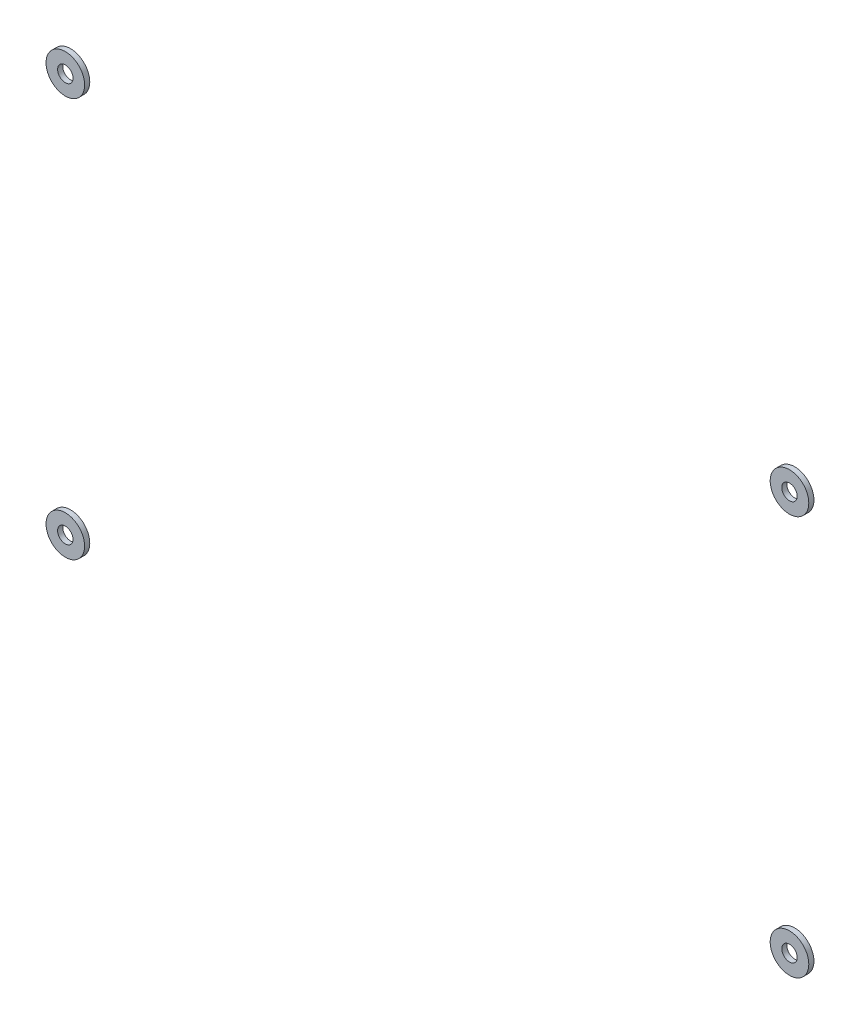
ISO-10303-21;
HEADER;
FILE_DESCRIPTION(('STEP AP214'),'2;1');
FILE_NAME('part.step','',(''),(''),'','','');
FILE_SCHEMA(('AUTOMOTIVE_DESIGN { 1 0 10303 214 1 1 1 1 }'));
ENDSEC;
DATA;
#1=APPLICATION_CONTEXT('core data for automotive mechanical design processes');
#2=APPLICATION_PROTOCOL_DEFINITION('international standard','automotive_design',2000,#1);
#3=PRODUCT_CONTEXT('',#1,'mechanical');
#4=PRODUCT('Part','Part','',(#3));
#5=PRODUCT_RELATED_PRODUCT_CATEGORY('part','',(#4));
#6=PRODUCT_DEFINITION_FORMATION('','',#4);
#7=PRODUCT_DEFINITION_CONTEXT('part definition',#1,'design');
#8=PRODUCT_DEFINITION('design','',#6,#7);
#9=PRODUCT_DEFINITION_SHAPE('','',#8);
#10=(LENGTH_UNIT() NAMED_UNIT(*) SI_UNIT(.MILLI.,.METRE.));
#11=(NAMED_UNIT(*) PLANE_ANGLE_UNIT() SI_UNIT($,.RADIAN.));
#12=(NAMED_UNIT(*) SI_UNIT($,.STERADIAN.) SOLID_ANGLE_UNIT());
#13=UNCERTAINTY_MEASURE_WITH_UNIT(LENGTH_MEASURE(1.E-05),#10,'distance_accuracy_value','');
#14=(GEOMETRIC_REPRESENTATION_CONTEXT(3) GLOBAL_UNCERTAINTY_ASSIGNED_CONTEXT((#13)) GLOBAL_UNIT_ASSIGNED_CONTEXT((#10,
#11,#12)) REPRESENTATION_CONTEXT('',''));
#15=CARTESIAN_POINT('',(0.,0.,0.));
#16=DIRECTION('',(0.,0.,1.));
#17=DIRECTION('',(1.,0.,0.));
#18=AXIS2_PLACEMENT_3D('',#15,#16,#17);
#19=CARTESIAN_POINT('',(56.3,140.55,71.5));
#20=DIRECTION('',(0.,0.,-1.));
#21=DIRECTION('',(-1.,0.,0.));
#22=AXIS2_PLACEMENT_3D('',#19,#20,#21);
#23=CYLINDRICAL_SURFACE('',#22,3.);
#24=CARTESIAN_POINT('',(56.3,140.55,71.5));
#25=DIRECTION('',(0.,0.,1.));
#26=DIRECTION('',(1.,0.,0.));
#27=AXIS2_PLACEMENT_3D('',#24,#25,#26);
#28=CIRCLE('',#27,3.);
#29=CARTESIAN_POINT('',(59.3,140.55,71.5));
#30=VERTEX_POINT('',#29);
#31=EDGE_CURVE('E11',#30,#30,#28,.T.);
#32=ORIENTED_EDGE('',*,*,#31,.F.);
#33=EDGE_LOOP('',(#32));
#34=FACE_BOUND('',#33,.T.);
#35=CARTESIAN_POINT('',(56.3,140.55,70.7));
#36=DIRECTION('',(0.,0.,1.));
#37=DIRECTION('',(1.,0.,0.));
#38=AXIS2_PLACEMENT_3D('',#35,#36,#37);
#39=CIRCLE('',#38,3.);
#40=CARTESIAN_POINT('',(59.3,140.55,70.7));
#41=VERTEX_POINT('',#40);
#42=EDGE_CURVE('E61',#41,#41,#39,.T.);
#43=ORIENTED_EDGE('',*,*,#42,.T.);
#44=EDGE_LOOP('',(#43));
#45=FACE_BOUND('',#44,.T.);
#46=ADVANCED_FACE('F54',(#34,#45),#23,.T.);
#47=CARTESIAN_POINT('',(56.3,140.55,71.5));
#48=DIRECTION('',(0.,0.,1.));
#49=DIRECTION('',(1.,0.,0.));
#50=AXIS2_PLACEMENT_3D('',#47,#48,#49);
#51=PLANE('',#50);
#52=CARTESIAN_POINT('',(56.3,140.55,71.5));
#53=DIRECTION('',(0.,0.,1.));
#54=DIRECTION('',(1.,0.,0.));
#55=AXIS2_PLACEMENT_3D('',#52,#53,#54);
#56=CIRCLE('',#55,1.2);
#57=CARTESIAN_POINT('',(57.5,140.55,71.5));
#58=VERTEX_POINT('',#57);
#59=EDGE_CURVE('E66',#58,#58,#56,.F.);
#60=ORIENTED_EDGE('',*,*,#59,.T.);
#61=EDGE_LOOP('',(#60));
#62=FACE_BOUND('',#61,.T.);
#63=ORIENTED_EDGE('',*,*,#31,.T.);
#64=EDGE_LOOP('',(#63));
#65=FACE_BOUND('',#64,.T.);
#66=ADVANCED_FACE('F79',(#62,#65),#51,.T.);
#67=CARTESIAN_POINT('',(56.3,140.55,70.7));
#68=DIRECTION('',(0.,0.,1.));
#69=DIRECTION('',(1.,0.,0.));
#70=AXIS2_PLACEMENT_3D('',#67,#68,#69);
#71=PLANE('',#70);
#72=CARTESIAN_POINT('',(56.3,140.55,70.7));
#73=DIRECTION('',(0.,0.,1.));
#74=DIRECTION('',(1.,0.,0.));
#75=AXIS2_PLACEMENT_3D('',#72,#73,#74);
#76=CIRCLE('',#75,1.2);
#77=CARTESIAN_POINT('',(57.5,140.55,70.7));
#78=VERTEX_POINT('',#77);
#79=EDGE_CURVE('E57',#78,#78,#76,.F.);
#80=ORIENTED_EDGE('',*,*,#79,.F.);
#81=EDGE_LOOP('',(#80));
#82=FACE_BOUND('',#81,.T.);
#83=ORIENTED_EDGE('',*,*,#42,.F.);
#84=EDGE_LOOP('',(#83));
#85=FACE_BOUND('',#84,.T.);
#86=ADVANCED_FACE('F76',(#82,#85),#71,.F.);
#87=CARTESIAN_POINT('',(56.3,140.55,73.1));
#88=DIRECTION('',(0.,0.,-1.));
#89=DIRECTION('',(-1.,0.,0.));
#90=AXIS2_PLACEMENT_3D('',#87,#88,#89);
#91=CYLINDRICAL_SURFACE('',#90,1.2);
#92=ORIENTED_EDGE('',*,*,#59,.F.);
#93=EDGE_LOOP('',(#92));
#94=FACE_BOUND('',#93,.T.);
#95=ORIENTED_EDGE('',*,*,#79,.T.);
#96=EDGE_LOOP('',(#95));
#97=FACE_BOUND('',#96,.T.);
#98=ADVANCED_FACE('F74',(#94,#97),#91,.F.);
#99=CLOSED_SHELL('',(#46,#66,#86,#98));
#100=MANIFOLD_SOLID_BREP('B2',#99);
#101=CARTESIAN_POINT('',(56.3,78.45,71.5));
#102=DIRECTION('',(0.,0.,-1.));
#103=DIRECTION('',(-1.,0.,0.));
#104=AXIS2_PLACEMENT_3D('',#101,#102,#103);
#105=CYLINDRICAL_SURFACE('',#104,3.);
#106=CARTESIAN_POINT('',(56.3,78.45,71.5));
#107=DIRECTION('',(0.,0.,1.));
#108=DIRECTION('',(1.,0.,0.));
#109=AXIS2_PLACEMENT_3D('',#106,#107,#108);
#110=CIRCLE('',#109,3.);
#111=CARTESIAN_POINT('',(59.3,78.45,71.5));
#112=VERTEX_POINT('',#111);
#113=EDGE_CURVE('E53',#112,#112,#110,.T.);
#114=ORIENTED_EDGE('',*,*,#113,.F.);
#115=EDGE_LOOP('',(#114));
#116=FACE_BOUND('',#115,.T.);
#117=CARTESIAN_POINT('',(56.3,78.45,70.7));
#118=DIRECTION('',(0.,0.,1.));
#119=DIRECTION('',(1.,0.,0.));
#120=AXIS2_PLACEMENT_3D('',#117,#118,#119);
#121=CIRCLE('',#120,3.);
#122=CARTESIAN_POINT('',(59.3,78.45,70.7));
#123=VERTEX_POINT('',#122);
#124=EDGE_CURVE('E134',#123,#123,#121,.T.);
#125=ORIENTED_EDGE('',*,*,#124,.T.);
#126=EDGE_LOOP('',(#125));
#127=FACE_BOUND('',#126,.T.);
#128=ADVANCED_FACE('F127',(#116,#127),#105,.T.);
#129=CARTESIAN_POINT('',(56.3,78.45,71.5));
#130=DIRECTION('',(0.,0.,1.));
#131=DIRECTION('',(1.,0.,0.));
#132=AXIS2_PLACEMENT_3D('',#129,#130,#131);
#133=PLANE('',#132);
#134=CARTESIAN_POINT('',(56.3,78.45,71.5));
#135=DIRECTION('',(0.,0.,1.));
#136=DIRECTION('',(1.,0.,0.));
#137=AXIS2_PLACEMENT_3D('',#134,#135,#136);
#138=CIRCLE('',#137,1.2);
#139=CARTESIAN_POINT('',(57.5,78.45,71.5));
#140=VERTEX_POINT('',#139);
#141=EDGE_CURVE('E139',#140,#140,#138,.F.);
#142=ORIENTED_EDGE('',*,*,#141,.T.);
#143=EDGE_LOOP('',(#142));
#144=FACE_BOUND('',#143,.T.);
#145=ORIENTED_EDGE('',*,*,#113,.T.);
#146=EDGE_LOOP('',(#145));
#147=FACE_BOUND('',#146,.T.);
#148=ADVANCED_FACE('F152',(#144,#147),#133,.T.);
#149=CARTESIAN_POINT('',(56.3,78.45,70.7));
#150=DIRECTION('',(0.,0.,1.));
#151=DIRECTION('',(1.,0.,0.));
#152=AXIS2_PLACEMENT_3D('',#149,#150,#151);
#153=PLANE('',#152);
#154=CARTESIAN_POINT('',(56.3,78.45,70.7));
#155=DIRECTION('',(0.,0.,1.));
#156=DIRECTION('',(1.,0.,0.));
#157=AXIS2_PLACEMENT_3D('',#154,#155,#156);
#158=CIRCLE('',#157,1.2);
#159=CARTESIAN_POINT('',(57.5,78.45,70.7));
#160=VERTEX_POINT('',#159);
#161=EDGE_CURVE('E130',#160,#160,#158,.F.);
#162=ORIENTED_EDGE('',*,*,#161,.F.);
#163=EDGE_LOOP('',(#162));
#164=FACE_BOUND('',#163,.T.);
#165=ORIENTED_EDGE('',*,*,#124,.F.);
#166=EDGE_LOOP('',(#165));
#167=FACE_BOUND('',#166,.T.);
#168=ADVANCED_FACE('F149',(#164,#167),#153,.F.);
#169=CARTESIAN_POINT('',(56.3,78.45,73.1));
#170=DIRECTION('',(0.,0.,-1.));
#171=DIRECTION('',(-1.,0.,0.));
#172=AXIS2_PLACEMENT_3D('',#169,#170,#171);
#173=CYLINDRICAL_SURFACE('',#172,1.2);
#174=ORIENTED_EDGE('',*,*,#141,.F.);
#175=EDGE_LOOP('',(#174));
#176=FACE_BOUND('',#175,.T.);
#177=ORIENTED_EDGE('',*,*,#161,.T.);
#178=EDGE_LOOP('',(#177));
#179=FACE_BOUND('',#178,.T.);
#180=ADVANCED_FACE('F147',(#176,#179),#173,.F.);
#181=CLOSED_SHELL('',(#128,#148,#168,#180));
#182=MANIFOLD_SOLID_BREP('B6',#181);
#183=CARTESIAN_POINT('',(-56.3,140.55,71.5));
#184=DIRECTION('',(0.,0.,-1.));
#185=DIRECTION('',(-1.,0.,0.));
#186=AXIS2_PLACEMENT_3D('',#183,#184,#185);
#187=CYLINDRICAL_SURFACE('',#186,3.);
#188=CARTESIAN_POINT('',(-56.3,140.55,71.5));
#189=DIRECTION('',(0.,0.,1.));
#190=DIRECTION('',(1.,0.,0.));
#191=AXIS2_PLACEMENT_3D('',#188,#189,#190);
#192=CIRCLE('',#191,3.);
#193=CARTESIAN_POINT('',(-53.3,140.55,71.5));
#194=VERTEX_POINT('',#193);
#195=EDGE_CURVE('E126',#194,#194,#192,.T.);
#196=ORIENTED_EDGE('',*,*,#195,.F.);
#197=EDGE_LOOP('',(#196));
#198=FACE_BOUND('',#197,.T.);
#199=CARTESIAN_POINT('',(-56.3,140.55,70.7));
#200=DIRECTION('',(0.,0.,1.));
#201=DIRECTION('',(1.,0.,0.));
#202=AXIS2_PLACEMENT_3D('',#199,#200,#201);
#203=CIRCLE('',#202,3.);
#204=CARTESIAN_POINT('',(-53.3,140.55,70.7));
#205=VERTEX_POINT('',#204);
#206=EDGE_CURVE('E207',#205,#205,#203,.T.);
#207=ORIENTED_EDGE('',*,*,#206,.T.);
#208=EDGE_LOOP('',(#207));
#209=FACE_BOUND('',#208,.T.);
#210=ADVANCED_FACE('F199',(#198,#209),#187,.T.);
#211=CARTESIAN_POINT('',(-56.3,140.55,71.5));
#212=DIRECTION('',(0.,0.,1.));
#213=DIRECTION('',(1.,0.,0.));
#214=AXIS2_PLACEMENT_3D('',#211,#212,#213);
#215=PLANE('',#214);
#216=CARTESIAN_POINT('',(-56.3,140.55,71.5));
#217=DIRECTION('',(0.,0.,1.));
#218=DIRECTION('',(1.,0.,0.));
#219=AXIS2_PLACEMENT_3D('',#216,#217,#218);
#220=CIRCLE('',#219,1.2);
#221=CARTESIAN_POINT('',(-55.1,140.55,71.5));
#222=VERTEX_POINT('',#221);
#223=EDGE_CURVE('E213',#222,#222,#220,.F.);
#224=ORIENTED_EDGE('',*,*,#223,.T.);
#225=EDGE_LOOP('',(#224));
#226=FACE_BOUND('',#225,.T.);
#227=ORIENTED_EDGE('',*,*,#195,.T.);
#228=EDGE_LOOP('',(#227));
#229=FACE_BOUND('',#228,.T.);
#230=ADVANCED_FACE('F228',(#226,#229),#215,.T.);
#231=CARTESIAN_POINT('',(-56.3,140.55,70.7));
#232=DIRECTION('',(0.,0.,1.));
#233=DIRECTION('',(1.,0.,0.));
#234=AXIS2_PLACEMENT_3D('',#231,#232,#233);
#235=PLANE('',#234);
#236=CARTESIAN_POINT('',(-56.3,140.55,70.7));
#237=DIRECTION('',(0.,0.,1.));
#238=DIRECTION('',(1.,0.,0.));
#239=AXIS2_PLACEMENT_3D('',#236,#237,#238);
#240=CIRCLE('',#239,1.2);
#241=CARTESIAN_POINT('',(-55.1,140.55,70.7));
#242=VERTEX_POINT('',#241);
#243=EDGE_CURVE('E202',#242,#242,#240,.F.);
#244=ORIENTED_EDGE('',*,*,#243,.F.);
#245=EDGE_LOOP('',(#244));
#246=FACE_BOUND('',#245,.T.);
#247=ORIENTED_EDGE('',*,*,#206,.F.);
#248=EDGE_LOOP('',(#247));
#249=FACE_BOUND('',#248,.T.);
#250=ADVANCED_FACE('F225',(#246,#249),#235,.F.);
#251=CARTESIAN_POINT('',(-56.3,140.55,73.1));
#252=DIRECTION('',(0.,0.,-1.));
#253=DIRECTION('',(-1.,0.,0.));
#254=AXIS2_PLACEMENT_3D('',#251,#252,#253);
#255=CYLINDRICAL_SURFACE('',#254,1.2);
#256=ORIENTED_EDGE('',*,*,#223,.F.);
#257=EDGE_LOOP('',(#256));
#258=FACE_BOUND('',#257,.T.);
#259=ORIENTED_EDGE('',*,*,#243,.T.);
#260=EDGE_LOOP('',(#259));
#261=FACE_BOUND('',#260,.T.);
#262=ADVANCED_FACE('F223',(#258,#261),#255,.F.);
#263=CLOSED_SHELL('',(#210,#230,#250,#262));
#264=MANIFOLD_SOLID_BREP('B48',#263);
#265=CARTESIAN_POINT('',(-56.3,78.45,71.5));
#266=DIRECTION('',(0.,0.,-1.));
#267=DIRECTION('',(-1.,0.,0.));
#268=AXIS2_PLACEMENT_3D('',#265,#266,#267);
#269=CYLINDRICAL_SURFACE('',#268,3.);
#270=CARTESIAN_POINT('',(-56.3,78.45,71.5));
#271=DIRECTION('',(0.,0.,1.));
#272=DIRECTION('',(1.,0.,0.));
#273=AXIS2_PLACEMENT_3D('',#270,#271,#272);
#274=CIRCLE('',#273,3.);
#275=CARTESIAN_POINT('',(-53.3,78.45,71.5));
#276=VERTEX_POINT('',#275);
#277=EDGE_CURVE('E198',#276,#276,#274,.T.);
#278=ORIENTED_EDGE('',*,*,#277,.F.);
#279=EDGE_LOOP('',(#278));
#280=FACE_BOUND('',#279,.T.);
#281=CARTESIAN_POINT('',(-56.3,78.45,70.7));
#282=DIRECTION('',(0.,0.,1.));
#283=DIRECTION('',(1.,0.,0.));
#284=AXIS2_PLACEMENT_3D('',#281,#282,#283);
#285=CIRCLE('',#284,3.);
#286=CARTESIAN_POINT('',(-53.3,78.45,70.7));
#287=VERTEX_POINT('',#286);
#288=EDGE_CURVE('E275',#287,#287,#285,.T.);
#289=ORIENTED_EDGE('',*,*,#288,.T.);
#290=EDGE_LOOP('',(#289));
#291=FACE_BOUND('',#290,.T.);
#292=ADVANCED_FACE('F268',(#280,#291),#269,.T.);
#293=CARTESIAN_POINT('',(-56.3,78.45,71.5));
#294=DIRECTION('',(0.,0.,1.));
#295=DIRECTION('',(1.,0.,0.));
#296=AXIS2_PLACEMENT_3D('',#293,#294,#295);
#297=PLANE('',#296);
#298=CARTESIAN_POINT('',(-56.3,78.45,71.5));
#299=DIRECTION('',(0.,0.,1.));
#300=DIRECTION('',(1.,0.,0.));
#301=AXIS2_PLACEMENT_3D('',#298,#299,#300);
#302=CIRCLE('',#301,1.2);
#303=CARTESIAN_POINT('',(-55.1,78.45,71.5));
#304=VERTEX_POINT('',#303);
#305=EDGE_CURVE('E280',#304,#304,#302,.F.);
#306=ORIENTED_EDGE('',*,*,#305,.T.);
#307=EDGE_LOOP('',(#306));
#308=FACE_BOUND('',#307,.T.);
#309=ORIENTED_EDGE('',*,*,#277,.T.);
#310=EDGE_LOOP('',(#309));
#311=FACE_BOUND('',#310,.T.);
#312=ADVANCED_FACE('F293',(#308,#311),#297,.T.);
#313=CARTESIAN_POINT('',(-56.3,78.45,70.7));
#314=DIRECTION('',(0.,0.,1.));
#315=DIRECTION('',(1.,0.,0.));
#316=AXIS2_PLACEMENT_3D('',#313,#314,#315);
#317=PLANE('',#316);
#318=CARTESIAN_POINT('',(-56.3,78.45,70.7));
#319=DIRECTION('',(0.,0.,1.));
#320=DIRECTION('',(1.,0.,0.));
#321=AXIS2_PLACEMENT_3D('',#318,#319,#320);
#322=CIRCLE('',#321,1.2);
#323=CARTESIAN_POINT('',(-55.1,78.45,70.7));
#324=VERTEX_POINT('',#323);
#325=EDGE_CURVE('E271',#324,#324,#322,.F.);
#326=ORIENTED_EDGE('',*,*,#325,.F.);
#327=EDGE_LOOP('',(#326));
#328=FACE_BOUND('',#327,.T.);
#329=ORIENTED_EDGE('',*,*,#288,.F.);
#330=EDGE_LOOP('',(#329));
#331=FACE_BOUND('',#330,.T.);
#332=ADVANCED_FACE('F290',(#328,#331),#317,.F.);
#333=CARTESIAN_POINT('',(-56.3,78.45,73.1));
#334=DIRECTION('',(0.,0.,-1.));
#335=DIRECTION('',(-1.,0.,0.));
#336=AXIS2_PLACEMENT_3D('',#333,#334,#335);
#337=CYLINDRICAL_SURFACE('',#336,1.2);
#338=ORIENTED_EDGE('',*,*,#305,.F.);
#339=EDGE_LOOP('',(#338));
#340=FACE_BOUND('',#339,.T.);
#341=ORIENTED_EDGE('',*,*,#325,.T.);
#342=EDGE_LOOP('',(#341));
#343=FACE_BOUND('',#342,.T.);
#344=ADVANCED_FACE('F288',(#340,#343),#337,.F.);
#345=CLOSED_SHELL('',(#292,#312,#332,#344));
#346=MANIFOLD_SOLID_BREP('B121',#345);
#347=ADVANCED_BREP_SHAPE_REPRESENTATION('',(#18,#100,#182,#264,#346),#14);
#348=SHAPE_DEFINITION_REPRESENTATION(#9,#347);
ENDSEC;
END-ISO-10303-21;
